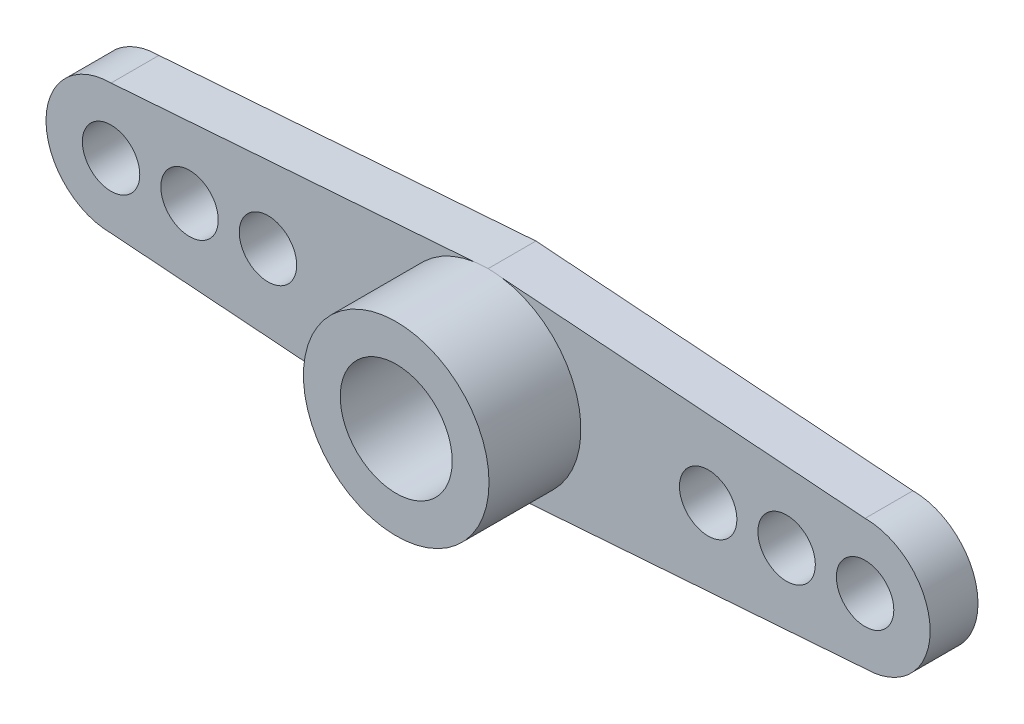
ISO-10303-21;
HEADER;
FILE_DESCRIPTION(('STEP AP214'),'2;1');
FILE_NAME('part.step','',(''),(''),'','','');
FILE_SCHEMA(('AUTOMOTIVE_DESIGN { 1 0 10303 214 1 1 1 1 }'));
ENDSEC;
DATA;
#1=APPLICATION_CONTEXT('core data for automotive mechanical design processes');
#2=APPLICATION_PROTOCOL_DEFINITION('international standard','automotive_design',2000,#1);
#3=PRODUCT_CONTEXT('',#1,'mechanical');
#4=PRODUCT('Part','Part','',(#3));
#5=PRODUCT_RELATED_PRODUCT_CATEGORY('part','',(#4));
#6=PRODUCT_DEFINITION_FORMATION('','',#4);
#7=PRODUCT_DEFINITION_CONTEXT('part definition',#1,'design');
#8=PRODUCT_DEFINITION('design','',#6,#7);
#9=PRODUCT_DEFINITION_SHAPE('','',#8);
#10=(LENGTH_UNIT() NAMED_UNIT(*) SI_UNIT(.MILLI.,.METRE.));
#11=(NAMED_UNIT(*) PLANE_ANGLE_UNIT() SI_UNIT($,.RADIAN.));
#12=(NAMED_UNIT(*) SI_UNIT($,.STERADIAN.) SOLID_ANGLE_UNIT());
#13=UNCERTAINTY_MEASURE_WITH_UNIT(LENGTH_MEASURE(1.E-05),#10,'distance_accuracy_value','');
#14=(GEOMETRIC_REPRESENTATION_CONTEXT(3) GLOBAL_UNCERTAINTY_ASSIGNED_CONTEXT((#13)) GLOBAL_UNIT_ASSIGNED_CONTEXT((#10,
#11,#12)) REPRESENTATION_CONTEXT('',''));
#15=CARTESIAN_POINT('',(0.,0.,0.));
#16=DIRECTION('',(0.,0.,1.));
#17=DIRECTION('',(1.,0.,0.));
#18=AXIS2_PLACEMENT_3D('',#15,#16,#17);
#19=CARTESIAN_POINT('',(0.,0.,2.5));
#20=DIRECTION('',(0.,0.,1.));
#21=DIRECTION('',(1.,0.,0.));
#22=AXIS2_PLACEMENT_3D('',#19,#20,#21);
#23=PLANE('',#22);
#24=CARTESIAN_POINT('',(0.,0.,2.5));
#25=DIRECTION('',(0.,0.,1.));
#26=DIRECTION('',(1.,0.,0.));
#27=AXIS2_PLACEMENT_3D('',#24,#25,#26);
#28=CIRCLE('',#27,4.85);
#29=CARTESIAN_POINT('',(-0.710112316356675,4.79773284981131,2.5));
#30=VERTEX_POINT('',#29);
#31=CARTESIAN_POINT('',(-0.710112316356675,-4.79773284981131,2.5));
#32=VERTEX_POINT('',#31);
#33=EDGE_CURVE('E11',#30,#32,#28,.T.);
#34=ORIENTED_EDGE('',*,*,#33,.F.);
#35=DIRECTION('',(0.997302177878483,0.0734054902499391,0.));
#36=VECTOR('',#35,1.);
#37=CARTESIAN_POINT('',(-0.355056158178335,4.82386642490565,2.5));
#38=LINE('',#37,#36);
#39=CARTESIAN_POINT('',(-19.7,3.4,2.5));
#40=VERTEX_POINT('',#39);
#41=EDGE_CURVE('E310',#40,#30,#38,.T.);
#42=ORIENTED_EDGE('',*,*,#41,.F.);
#43=CARTESIAN_POINT('',(-19.7,0.,2.5));
#44=DIRECTION('',(0.,0.,1.));
#45=DIRECTION('',(1.,0.,0.));
#46=AXIS2_PLACEMENT_3D('',#43,#44,#45);
#47=CIRCLE('',#46,3.4);
#48=CARTESIAN_POINT('',(-19.7,-3.4,2.5));
#49=VERTEX_POINT('',#48);
#50=EDGE_CURVE('E302',#40,#49,#47,.T.);
#51=ORIENTED_EDGE('',*,*,#50,.T.);
#52=DIRECTION('',(0.997302177878483,-0.0734054902499391,0.));
#53=VECTOR('',#52,1.);
#54=CARTESIAN_POINT('',(-0.355056158178335,-4.82386642490565,2.5));
#55=LINE('',#54,#53);
#56=EDGE_CURVE('E319',#49,#32,#55,.T.);
#57=ORIENTED_EDGE('',*,*,#56,.T.);
#58=EDGE_LOOP('',(#34,#42,#51,#57));
#59=FACE_BOUND('',#58,.T.);
#60=CARTESIAN_POINT('',(-11.5,0.,2.5));
#61=DIRECTION('',(0.,0.,1.));
#62=DIRECTION('',(1.,0.,0.));
#63=AXIS2_PLACEMENT_3D('',#60,#61,#62);
#64=CIRCLE('',#63,1.5);
#65=CARTESIAN_POINT('',(-10.,0.,2.5));
#66=VERTEX_POINT('',#65);
#67=EDGE_CURVE('E312',#66,#66,#64,.T.);
#68=ORIENTED_EDGE('',*,*,#67,.F.);
#69=EDGE_LOOP('',(#68));
#70=FACE_BOUND('',#69,.T.);
#71=CARTESIAN_POINT('',(-15.6,0.,2.5));
#72=DIRECTION('',(0.,0.,1.));
#73=DIRECTION('',(1.,0.,0.));
#74=AXIS2_PLACEMENT_3D('',#71,#72,#73);
#75=CIRCLE('',#74,1.5);
#76=CARTESIAN_POINT('',(-14.1,0.,2.5));
#77=VERTEX_POINT('',#76);
#78=EDGE_CURVE('E241',#77,#77,#75,.T.);
#79=ORIENTED_EDGE('',*,*,#78,.F.);
#80=EDGE_LOOP('',(#79));
#81=FACE_BOUND('',#80,.T.);
#82=CARTESIAN_POINT('',(-19.7,0.,2.5));
#83=DIRECTION('',(0.,0.,1.));
#84=DIRECTION('',(1.,0.,0.));
#85=AXIS2_PLACEMENT_3D('',#82,#83,#84);
#86=CIRCLE('',#85,1.5);
#87=CARTESIAN_POINT('',(-18.2,0.,2.5));
#88=VERTEX_POINT('',#87);
#89=EDGE_CURVE('E285',#88,#88,#86,.T.);
#90=ORIENTED_EDGE('',*,*,#89,.F.);
#91=EDGE_LOOP('',(#90));
#92=FACE_BOUND('',#91,.T.);
#93=ADVANCED_FACE('F39',(#59,#70,#81,#92),#23,.T.);
#94=CARTESIAN_POINT('',(-0.355056158178335,4.82386642490565,2.5));
#95=DIRECTION('',(-0.0734054902499391,0.997302177878483,0.));
#96=DIRECTION('',(-0.997302177878483,-0.0734054902499391,0.));
#97=AXIS2_PLACEMENT_3D('',#94,#95,#96);
#98=PLANE('',#97);
#99=DIRECTION('',(0.997302177878483,0.0734054902499391,0.));
#100=VECTOR('',#99,1.);
#101=CARTESIAN_POINT('',(-0.355056158178335,4.82386642490565,0.));
#102=LINE('',#101,#100);
#103=CARTESIAN_POINT('',(-19.7,3.4,0.));
#104=VERTEX_POINT('',#103);
#105=CARTESIAN_POINT('',(0.,4.85,0.));
#106=VERTEX_POINT('',#105);
#107=EDGE_CURVE('E250',#104,#106,#102,.T.);
#108=ORIENTED_EDGE('',*,*,#107,.F.);
#109=DIRECTION('',(0.,0.,-1.));
#110=VECTOR('',#109,1.);
#111=CARTESIAN_POINT('',(-19.7,3.4,2.5));
#112=LINE('',#111,#110);
#113=EDGE_CURVE('E133',#40,#104,#112,.T.);
#114=ORIENTED_EDGE('',*,*,#113,.F.);
#115=ORIENTED_EDGE('',*,*,#41,.T.);
#116=CARTESIAN_POINT('',(0.,4.85,2.5));
#117=VERTEX_POINT('',#116);
#118=EDGE_CURVE('E309',#30,#117,#38,.T.);
#119=ORIENTED_EDGE('',*,*,#118,.T.);
#120=DIRECTION('',(0.,0.,-1.));
#121=VECTOR('',#120,1.);
#122=CARTESIAN_POINT('',(0.,4.85,2.5));
#123=LINE('',#122,#121);
#124=EDGE_CURVE('E113',#117,#106,#123,.T.);
#125=ORIENTED_EDGE('',*,*,#124,.T.);
#126=EDGE_LOOP('',(#108,#114,#115,#119,#125));
#127=FACE_BOUND('',#126,.T.);
#128=ADVANCED_FACE('F172',(#127),#98,.T.);
#129=CARTESIAN_POINT('',(-19.7,0.,2.5));
#130=DIRECTION('',(0.,0.,-1.));
#131=DIRECTION('',(-1.,0.,0.));
#132=AXIS2_PLACEMENT_3D('',#129,#130,#131);
#133=CYLINDRICAL_SURFACE('',#132,3.4);
#134=CARTESIAN_POINT('',(-19.7,0.,0.));
#135=DIRECTION('',(0.,0.,1.));
#136=DIRECTION('',(1.,0.,0.));
#137=AXIS2_PLACEMENT_3D('',#134,#135,#136);
#138=CIRCLE('',#137,3.4);
#139=CARTESIAN_POINT('',(-19.7,-3.4,0.));
#140=VERTEX_POINT('',#139);
#141=EDGE_CURVE('E258',#104,#140,#138,.T.);
#142=ORIENTED_EDGE('',*,*,#141,.T.);
#143=DIRECTION('',(0.,0.,-1.));
#144=VECTOR('',#143,1.);
#145=CARTESIAN_POINT('',(-19.7,-3.4,2.5));
#146=LINE('',#145,#144);
#147=EDGE_CURVE('E296',#49,#140,#146,.T.);
#148=ORIENTED_EDGE('',*,*,#147,.F.);
#149=ORIENTED_EDGE('',*,*,#50,.F.);
#150=ORIENTED_EDGE('',*,*,#113,.T.);
#151=EDGE_LOOP('',(#142,#148,#149,#150));
#152=FACE_BOUND('',#151,.T.);
#153=ADVANCED_FACE('F178',(#152),#133,.T.);
#154=CARTESIAN_POINT('',(-0.355056158178335,-4.82386642490565,2.5));
#155=DIRECTION('',(0.0734054902499391,0.997302177878483,0.));
#156=DIRECTION('',(-0.997302177878483,0.0734054902499391,0.));
#157=AXIS2_PLACEMENT_3D('',#154,#155,#156);
#158=PLANE('',#157);
#159=DIRECTION('',(0.997302177878483,-0.0734054902499391,0.));
#160=VECTOR('',#159,1.);
#161=CARTESIAN_POINT('',(-0.355056158178335,-4.82386642490565,0.));
#162=LINE('',#161,#160);
#163=CARTESIAN_POINT('',(0.,-4.85,0.));
#164=VERTEX_POINT('',#163);
#165=EDGE_CURVE('E261',#140,#164,#162,.T.);
#166=ORIENTED_EDGE('',*,*,#165,.T.);
#167=DIRECTION('',(0.,0.,-1.));
#168=VECTOR('',#167,1.);
#169=CARTESIAN_POINT('',(0.,-4.85,2.5));
#170=LINE('',#169,#168);
#171=CARTESIAN_POINT('',(0.,-4.85,2.5));
#172=VERTEX_POINT('',#171);
#173=EDGE_CURVE('E293',#172,#164,#170,.T.);
#174=ORIENTED_EDGE('',*,*,#173,.F.);
#175=EDGE_CURVE('E64',#32,#172,#55,.T.);
#176=ORIENTED_EDGE('',*,*,#175,.F.);
#177=ORIENTED_EDGE('',*,*,#56,.F.);
#178=ORIENTED_EDGE('',*,*,#147,.T.);
#179=EDGE_LOOP('',(#166,#174,#176,#177,#178));
#180=FACE_BOUND('',#179,.T.);
#181=ADVANCED_FACE('F225',(#180),#158,.F.);
#182=CARTESIAN_POINT('',(0.355056158178335,-4.82386642490565,2.5));
#183=DIRECTION('',(-0.0734054902499391,0.997302177878483,0.));
#184=DIRECTION('',(-0.997302177878483,-0.0734054902499391,0.));
#185=AXIS2_PLACEMENT_3D('',#182,#183,#184);
#186=PLANE('',#185);
#187=DIRECTION('',(0.997302177878483,0.0734054902499391,0.));
#188=VECTOR('',#187,1.);
#189=CARTESIAN_POINT('',(0.355056158178335,-4.82386642490565,0.));
#190=LINE('',#189,#188);
#191=CARTESIAN_POINT('',(19.7,-3.4,0.));
#192=VERTEX_POINT('',#191);
#193=EDGE_CURVE('E264',#164,#192,#190,.T.);
#194=ORIENTED_EDGE('',*,*,#193,.T.);
#195=DIRECTION('',(0.,0.,-1.));
#196=VECTOR('',#195,1.);
#197=CARTESIAN_POINT('',(19.7,-3.4,2.5));
#198=LINE('',#197,#196);
#199=CARTESIAN_POINT('',(19.7,-3.4,2.5));
#200=VERTEX_POINT('',#199);
#201=EDGE_CURVE('E290',#200,#192,#198,.T.);
#202=ORIENTED_EDGE('',*,*,#201,.F.);
#203=DIRECTION('',(0.997302177878483,0.0734054902499391,0.));
#204=VECTOR('',#203,1.);
#205=CARTESIAN_POINT('',(0.355056158178335,-4.82386642490565,2.5));
#206=LINE('',#205,#204);
#207=CARTESIAN_POINT('',(0.710112316356675,-4.79773284981131,2.5));
#208=VERTEX_POINT('',#207);
#209=EDGE_CURVE('E321',#208,#200,#206,.T.);
#210=ORIENTED_EDGE('',*,*,#209,.F.);
#211=EDGE_CURVE('E322',#172,#208,#206,.T.);
#212=ORIENTED_EDGE('',*,*,#211,.F.);
#213=ORIENTED_EDGE('',*,*,#173,.T.);
#214=EDGE_LOOP('',(#194,#202,#210,#212,#213));
#215=FACE_BOUND('',#214,.T.);
#216=ADVANCED_FACE('F221',(#215),#186,.F.);
#217=CARTESIAN_POINT('',(19.7,0.,2.5));
#218=DIRECTION('',(0.,0.,-1.));
#219=DIRECTION('',(-1.,0.,0.));
#220=AXIS2_PLACEMENT_3D('',#217,#218,#219);
#221=CYLINDRICAL_SURFACE('',#220,3.4);
#222=CARTESIAN_POINT('',(19.7,0.,0.));
#223=DIRECTION('',(0.,0.,1.));
#224=DIRECTION('',(1.,0.,0.));
#225=AXIS2_PLACEMENT_3D('',#222,#223,#224);
#226=CIRCLE('',#225,3.4);
#227=CARTESIAN_POINT('',(19.7,3.4,0.));
#228=VERTEX_POINT('',#227);
#229=EDGE_CURVE('E267',#192,#228,#226,.T.);
#230=ORIENTED_EDGE('',*,*,#229,.T.);
#231=DIRECTION('',(0.,0.,-1.));
#232=VECTOR('',#231,1.);
#233=CARTESIAN_POINT('',(19.7,3.4,2.5));
#234=LINE('',#233,#232);
#235=CARTESIAN_POINT('',(19.7,3.4,2.5));
#236=VERTEX_POINT('',#235);
#237=EDGE_CURVE('E287',#236,#228,#234,.T.);
#238=ORIENTED_EDGE('',*,*,#237,.F.);
#239=CARTESIAN_POINT('',(19.7,0.,2.5));
#240=DIRECTION('',(0.,0.,1.));
#241=DIRECTION('',(1.,0.,0.));
#242=AXIS2_PLACEMENT_3D('',#239,#240,#241);
#243=CIRCLE('',#242,3.4);
#244=EDGE_CURVE('E122',#200,#236,#243,.T.);
#245=ORIENTED_EDGE('',*,*,#244,.F.);
#246=ORIENTED_EDGE('',*,*,#201,.T.);
#247=EDGE_LOOP('',(#230,#238,#245,#246));
#248=FACE_BOUND('',#247,.T.);
#249=ADVANCED_FACE('F207',(#248),#221,.T.);
#250=CARTESIAN_POINT('',(15.6,0.,2.5));
#251=DIRECTION('',(0.,0.,-1.));
#252=DIRECTION('',(-1.,0.,0.));
#253=AXIS2_PLACEMENT_3D('',#250,#251,#252);
#254=CYLINDRICAL_SURFACE('',#253,1.5);
#255=CARTESIAN_POINT('',(15.6,0.,2.5));
#256=DIRECTION('',(0.,0.,1.));
#257=DIRECTION('',(1.,0.,0.));
#258=AXIS2_PLACEMENT_3D('',#255,#256,#257);
#259=CIRCLE('',#258,1.5);
#260=CARTESIAN_POINT('',(17.1,0.,2.5));
#261=VERTEX_POINT('',#260);
#262=EDGE_CURVE('E330',#261,#261,#259,.T.);
#263=ORIENTED_EDGE('',*,*,#262,.T.);
#264=EDGE_LOOP('',(#263));
#265=FACE_BOUND('',#264,.T.);
#266=CARTESIAN_POINT('',(15.6,0.,0.));
#267=DIRECTION('',(0.,0.,1.));
#268=DIRECTION('',(1.,0.,0.));
#269=AXIS2_PLACEMENT_3D('',#266,#267,#268);
#270=CIRCLE('',#269,1.5);
#271=CARTESIAN_POINT('',(17.1,0.,0.));
#272=VERTEX_POINT('',#271);
#273=EDGE_CURVE('E279',#272,#272,#270,.T.);
#274=ORIENTED_EDGE('',*,*,#273,.F.);
#275=EDGE_LOOP('',(#274));
#276=FACE_BOUND('',#275,.T.);
#277=ADVANCED_FACE('F203',(#265,#276),#254,.F.);
#278=CARTESIAN_POINT('',(19.7,0.,2.5));
#279=DIRECTION('',(0.,0.,-1.));
#280=DIRECTION('',(-1.,0.,0.));
#281=AXIS2_PLACEMENT_3D('',#278,#279,#280);
#282=CYLINDRICAL_SURFACE('',#281,1.5);
#283=CARTESIAN_POINT('',(19.7,0.,2.5));
#284=DIRECTION('',(0.,0.,1.));
#285=DIRECTION('',(1.,0.,0.));
#286=AXIS2_PLACEMENT_3D('',#283,#284,#285);
#287=CIRCLE('',#286,1.5);
#288=CARTESIAN_POINT('',(21.2,0.,2.5));
#289=VERTEX_POINT('',#288);
#290=EDGE_CURVE('E117',#289,#289,#287,.T.);
#291=ORIENTED_EDGE('',*,*,#290,.T.);
#292=EDGE_LOOP('',(#291));
#293=FACE_BOUND('',#292,.T.);
#294=CARTESIAN_POINT('',(19.7,0.,0.));
#295=DIRECTION('',(0.,0.,1.));
#296=DIRECTION('',(1.,0.,0.));
#297=AXIS2_PLACEMENT_3D('',#294,#295,#296);
#298=CIRCLE('',#297,1.5);
#299=CARTESIAN_POINT('',(21.2,0.,0.));
#300=VERTEX_POINT('',#299);
#301=EDGE_CURVE('E276',#300,#300,#298,.T.);
#302=ORIENTED_EDGE('',*,*,#301,.F.);
#303=EDGE_LOOP('',(#302));
#304=FACE_BOUND('',#303,.T.);
#305=ADVANCED_FACE('F206',(#293,#304),#282,.F.);
#306=CARTESIAN_POINT('',(0.,0.,2.5));
#307=DIRECTION('',(0.,0.,-1.));
#308=DIRECTION('',(-1.,0.,0.));
#309=AXIS2_PLACEMENT_3D('',#306,#307,#308);
#310=CYLINDRICAL_SURFACE('',#309,3.);
#311=CARTESIAN_POINT('',(0.,0.,2.5));
#312=DIRECTION('',(0.,0.,1.));
#313=DIRECTION('',(1.,0.,0.));
#314=AXIS2_PLACEMENT_3D('',#311,#312,#313);
#315=CIRCLE('',#314,3.);
#316=CARTESIAN_POINT('',(3.,0.,2.5));
#317=VERTEX_POINT('',#316);
#318=EDGE_CURVE('E137',#317,#317,#315,.T.);
#319=ORIENTED_EDGE('',*,*,#318,.T.);
#320=EDGE_LOOP('',(#319));
#321=FACE_BOUND('',#320,.T.);
#322=CARTESIAN_POINT('',(0.,0.,0.));
#323=DIRECTION('',(0.,0.,1.));
#324=DIRECTION('',(1.,0.,0.));
#325=AXIS2_PLACEMENT_3D('',#322,#323,#324);
#326=CIRCLE('',#325,3.);
#327=CARTESIAN_POINT('',(3.,0.,0.));
#328=VERTEX_POINT('',#327);
#329=EDGE_CURVE('E273',#328,#328,#326,.T.);
#330=ORIENTED_EDGE('',*,*,#329,.F.);
#331=EDGE_LOOP('',(#330));
#332=FACE_BOUND('',#331,.T.);
#333=ADVANCED_FACE('F211',(#321,#332),#310,.F.);
#334=CARTESIAN_POINT('',(0.355056158178335,4.82386642490565,2.5));
#335=DIRECTION('',(0.0734054902499391,0.997302177878483,0.));
#336=DIRECTION('',(-0.997302177878483,0.0734054902499391,0.));
#337=AXIS2_PLACEMENT_3D('',#334,#335,#336);
#338=PLANE('',#337);
#339=DIRECTION('',(0.997302177878483,-0.0734054902499391,0.));
#340=VECTOR('',#339,1.);
#341=CARTESIAN_POINT('',(0.355056158178335,4.82386642490565,0.));
#342=LINE('',#341,#340);
#343=EDGE_CURVE('E270',#106,#228,#342,.T.);
#344=ORIENTED_EDGE('',*,*,#343,.F.);
#345=ORIENTED_EDGE('',*,*,#124,.F.);
#346=DIRECTION('',(0.997302177878483,-0.0734054902499391,0.));
#347=VECTOR('',#346,1.);
#348=CARTESIAN_POINT('',(0.355056158178335,4.82386642490565,2.5));
#349=LINE('',#348,#347);
#350=CARTESIAN_POINT('',(0.710112316356675,4.79773284981131,2.5));
#351=VERTEX_POINT('',#350);
#352=EDGE_CURVE('E108',#117,#351,#349,.T.);
#353=ORIENTED_EDGE('',*,*,#352,.T.);
#354=EDGE_CURVE('E111',#351,#236,#349,.T.);
#355=ORIENTED_EDGE('',*,*,#354,.T.);
#356=ORIENTED_EDGE('',*,*,#237,.T.);
#357=EDGE_LOOP('',(#344,#345,#353,#355,#356));
#358=FACE_BOUND('',#357,.T.);
#359=ADVANCED_FACE('F110',(#358),#338,.T.);
#360=CARTESIAN_POINT('',(-11.5,0.,2.5));
#361=DIRECTION('',(0.,0.,-1.));
#362=DIRECTION('',(-1.,0.,0.));
#363=AXIS2_PLACEMENT_3D('',#360,#361,#362);
#364=CYLINDRICAL_SURFACE('',#363,1.5);
#365=ORIENTED_EDGE('',*,*,#67,.T.);
#366=EDGE_LOOP('',(#365));
#367=FACE_BOUND('',#366,.T.);
#368=CARTESIAN_POINT('',(-11.5,0.,0.));
#369=DIRECTION('',(0.,0.,1.));
#370=DIRECTION('',(1.,0.,0.));
#371=AXIS2_PLACEMENT_3D('',#368,#369,#370);
#372=CIRCLE('',#371,1.5);
#373=CARTESIAN_POINT('',(-10.,0.,0.));
#374=VERTEX_POINT('',#373);
#375=EDGE_CURVE('E246',#374,#374,#372,.T.);
#376=ORIENTED_EDGE('',*,*,#375,.F.);
#377=EDGE_LOOP('',(#376));
#378=FACE_BOUND('',#377,.T.);
#379=ADVANCED_FACE('F218',(#367,#378),#364,.F.);
#380=CARTESIAN_POINT('',(-15.6,0.,2.5));
#381=DIRECTION('',(0.,0.,-1.));
#382=DIRECTION('',(-1.,0.,0.));
#383=AXIS2_PLACEMENT_3D('',#380,#381,#382);
#384=CYLINDRICAL_SURFACE('',#383,1.5);
#385=ORIENTED_EDGE('',*,*,#78,.T.);
#386=EDGE_LOOP('',(#385));
#387=FACE_BOUND('',#386,.T.);
#388=CARTESIAN_POINT('',(-15.6,0.,0.));
#389=DIRECTION('',(0.,0.,1.));
#390=DIRECTION('',(1.,0.,0.));
#391=AXIS2_PLACEMENT_3D('',#388,#389,#390);
#392=CIRCLE('',#391,1.5);
#393=CARTESIAN_POINT('',(-14.1,0.,0.));
#394=VERTEX_POINT('',#393);
#395=EDGE_CURVE('E244',#394,#394,#392,.T.);
#396=ORIENTED_EDGE('',*,*,#395,.F.);
#397=EDGE_LOOP('',(#396));
#398=FACE_BOUND('',#397,.T.);
#399=ADVANCED_FACE('F198',(#387,#398),#384,.F.);
#400=CARTESIAN_POINT('',(-19.7,0.,2.5));
#401=DIRECTION('',(0.,0.,-1.));
#402=DIRECTION('',(-1.,0.,0.));
#403=AXIS2_PLACEMENT_3D('',#400,#401,#402);
#404=CYLINDRICAL_SURFACE('',#403,1.5);
#405=ORIENTED_EDGE('',*,*,#89,.T.);
#406=EDGE_LOOP('',(#405));
#407=FACE_BOUND('',#406,.T.);
#408=CARTESIAN_POINT('',(-19.7,0.,0.));
#409=DIRECTION('',(0.,0.,1.));
#410=DIRECTION('',(1.,0.,0.));
#411=AXIS2_PLACEMENT_3D('',#408,#409,#410);
#412=CIRCLE('',#411,1.5);
#413=CARTESIAN_POINT('',(-18.2,0.,0.));
#414=VERTEX_POINT('',#413);
#415=EDGE_CURVE('E247',#414,#414,#412,.T.);
#416=ORIENTED_EDGE('',*,*,#415,.F.);
#417=EDGE_LOOP('',(#416));
#418=FACE_BOUND('',#417,.T.);
#419=ADVANCED_FACE('F41',(#407,#418),#404,.F.);
#420=CARTESIAN_POINT('',(11.5,0.,2.5));
#421=DIRECTION('',(0.,0.,-1.));
#422=DIRECTION('',(-1.,0.,0.));
#423=AXIS2_PLACEMENT_3D('',#420,#421,#422);
#424=CYLINDRICAL_SURFACE('',#423,1.5);
#425=CARTESIAN_POINT('',(11.5,0.,2.5));
#426=DIRECTION('',(0.,0.,1.));
#427=DIRECTION('',(1.,0.,0.));
#428=AXIS2_PLACEMENT_3D('',#425,#426,#427);
#429=CIRCLE('',#428,1.5);
#430=CARTESIAN_POINT('',(13.,0.,2.5));
#431=VERTEX_POINT('',#430);
#432=EDGE_CURVE('E288',#431,#431,#429,.T.);
#433=ORIENTED_EDGE('',*,*,#432,.T.);
#434=EDGE_LOOP('',(#433));
#435=FACE_BOUND('',#434,.T.);
#436=CARTESIAN_POINT('',(11.5,0.,0.));
#437=DIRECTION('',(0.,0.,1.));
#438=DIRECTION('',(1.,0.,0.));
#439=AXIS2_PLACEMENT_3D('',#436,#437,#438);
#440=CIRCLE('',#439,1.5);
#441=CARTESIAN_POINT('',(13.,0.,0.));
#442=VERTEX_POINT('',#441);
#443=EDGE_CURVE('E282',#442,#442,#440,.T.);
#444=ORIENTED_EDGE('',*,*,#443,.F.);
#445=EDGE_LOOP('',(#444));
#446=FACE_BOUND('',#445,.T.);
#447=ADVANCED_FACE('F186',(#435,#446),#424,.F.);
#448=EDGE_CURVE('E48',#208,#351,#28,.T.);
#449=ORIENTED_EDGE('',*,*,#448,.F.);
#450=ORIENTED_EDGE('',*,*,#209,.T.);
#451=ORIENTED_EDGE('',*,*,#244,.T.);
#452=ORIENTED_EDGE('',*,*,#354,.F.);
#453=EDGE_LOOP('',(#449,#450,#451,#452));
#454=FACE_BOUND('',#453,.T.);
#455=ORIENTED_EDGE('',*,*,#290,.F.);
#456=EDGE_LOOP('',(#455));
#457=FACE_BOUND('',#456,.T.);
#458=ORIENTED_EDGE('',*,*,#262,.F.);
#459=EDGE_LOOP('',(#458));
#460=FACE_BOUND('',#459,.T.);
#461=ORIENTED_EDGE('',*,*,#432,.F.);
#462=EDGE_LOOP('',(#461));
#463=FACE_BOUND('',#462,.T.);
#464=ADVANCED_FACE('F119',(#454,#457,#460,#463),#23,.T.);
#465=CARTESIAN_POINT('',(0.,0.,0.));
#466=DIRECTION('',(0.,0.,1.));
#467=DIRECTION('',(1.,0.,0.));
#468=AXIS2_PLACEMENT_3D('',#465,#466,#467);
#469=PLANE('',#468);
#470=ORIENTED_EDGE('',*,*,#415,.T.);
#471=EDGE_LOOP('',(#470));
#472=FACE_BOUND('',#471,.T.);
#473=ORIENTED_EDGE('',*,*,#395,.T.);
#474=EDGE_LOOP('',(#473));
#475=FACE_BOUND('',#474,.T.);
#476=ORIENTED_EDGE('',*,*,#375,.T.);
#477=EDGE_LOOP('',(#476));
#478=FACE_BOUND('',#477,.T.);
#479=ORIENTED_EDGE('',*,*,#107,.T.);
#480=ORIENTED_EDGE('',*,*,#343,.T.);
#481=ORIENTED_EDGE('',*,*,#229,.F.);
#482=ORIENTED_EDGE('',*,*,#193,.F.);
#483=ORIENTED_EDGE('',*,*,#165,.F.);
#484=ORIENTED_EDGE('',*,*,#141,.F.);
#485=EDGE_LOOP('',(#479,#480,#481,#482,#483,#484));
#486=FACE_BOUND('',#485,.T.);
#487=ORIENTED_EDGE('',*,*,#329,.T.);
#488=EDGE_LOOP('',(#487));
#489=FACE_BOUND('',#488,.T.);
#490=ORIENTED_EDGE('',*,*,#301,.T.);
#491=EDGE_LOOP('',(#490));
#492=FACE_BOUND('',#491,.T.);
#493=ORIENTED_EDGE('',*,*,#273,.T.);
#494=EDGE_LOOP('',(#493));
#495=FACE_BOUND('',#494,.T.);
#496=ORIENTED_EDGE('',*,*,#443,.T.);
#497=EDGE_LOOP('',(#496));
#498=FACE_BOUND('',#497,.T.);
#499=ADVANCED_FACE('F185',(#472,#475,#478,#486,#489,#492,#495,#498),#469,.F.);
#500=CARTESIAN_POINT('',(0.,0.,7.3));
#501=DIRECTION('',(0.,0.,1.));
#502=DIRECTION('',(1.,0.,0.));
#503=AXIS2_PLACEMENT_3D('',#500,#501,#502);
#504=PLANE('',#503);
#505=CARTESIAN_POINT('',(0.,0.,7.3));
#506=DIRECTION('',(0.,0.,1.));
#507=DIRECTION('',(1.,0.,0.));
#508=AXIS2_PLACEMENT_3D('',#505,#506,#507);
#509=CIRCLE('',#508,2.925);
#510=CARTESIAN_POINT('',(2.925,0.,7.3));
#511=VERTEX_POINT('',#510);
#512=EDGE_CURVE('E143',#511,#511,#509,.T.);
#513=ORIENTED_EDGE('',*,*,#512,.F.);
#514=EDGE_LOOP('',(#513));
#515=FACE_BOUND('',#514,.T.);
#516=CARTESIAN_POINT('',(0.,0.,7.3));
#517=DIRECTION('',(0.,0.,1.));
#518=DIRECTION('',(1.,0.,0.));
#519=AXIS2_PLACEMENT_3D('',#516,#517,#518);
#520=CIRCLE('',#519,4.85);
#521=CARTESIAN_POINT('',(4.85,0.,7.3));
#522=VERTEX_POINT('',#521);
#523=EDGE_CURVE('E135',#522,#522,#520,.T.);
#524=ORIENTED_EDGE('',*,*,#523,.T.);
#525=EDGE_LOOP('',(#524));
#526=FACE_BOUND('',#525,.T.);
#527=ADVANCED_FACE('F191',(#515,#526),#504,.T.);
#528=CARTESIAN_POINT('',(0.,0.,7.3));
#529=DIRECTION('',(0.,0.,-1.));
#530=DIRECTION('',(-1.,0.,0.));
#531=AXIS2_PLACEMENT_3D('',#528,#529,#530);
#532=CYLINDRICAL_SURFACE('',#531,4.85);
#533=ORIENTED_EDGE('',*,*,#523,.F.);
#534=EDGE_LOOP('',(#533));
#535=FACE_BOUND('',#534,.T.);
#536=EDGE_CURVE('E129',#351,#117,#28,.T.);
#537=ORIENTED_EDGE('',*,*,#536,.T.);
#538=EDGE_CURVE('E50',#117,#30,#28,.T.);
#539=ORIENTED_EDGE('',*,*,#538,.T.);
#540=ORIENTED_EDGE('',*,*,#33,.T.);
#541=EDGE_CURVE('E139',#32,#172,#28,.T.);
#542=ORIENTED_EDGE('',*,*,#541,.T.);
#543=EDGE_CURVE('E132',#172,#208,#28,.T.);
#544=ORIENTED_EDGE('',*,*,#543,.T.);
#545=ORIENTED_EDGE('',*,*,#448,.T.);
#546=EDGE_LOOP('',(#537,#539,#540,#542,#544,#545));
#547=FACE_BOUND('',#546,.T.);
#548=ADVANCED_FACE('F127',(#535,#547),#532,.T.);
#549=CARTESIAN_POINT('',(0.,0.,2.5));
#550=DIRECTION('',(0.,0.,1.));
#551=DIRECTION('',(1.,0.,0.));
#552=AXIS2_PLACEMENT_3D('',#549,#550,#551);
#553=PLANE('',#552);
#554=ORIENTED_EDGE('',*,*,#352,.F.);
#555=ORIENTED_EDGE('',*,*,#536,.F.);
#556=EDGE_LOOP('',(#554,#555));
#557=FACE_BOUND('',#556,.T.);
#558=ADVANCED_FACE('F134',(#557),#553,.F.);
#559=ORIENTED_EDGE('',*,*,#118,.F.);
#560=ORIENTED_EDGE('',*,*,#538,.F.);
#561=EDGE_LOOP('',(#559,#560));
#562=FACE_BOUND('',#561,.T.);
#563=ADVANCED_FACE('F359',(#562),#553,.F.);
#564=ORIENTED_EDGE('',*,*,#543,.F.);
#565=ORIENTED_EDGE('',*,*,#211,.T.);
#566=EDGE_LOOP('',(#564,#565));
#567=FACE_BOUND('',#566,.T.);
#568=ADVANCED_FACE('F355',(#567),#553,.F.);
#569=ORIENTED_EDGE('',*,*,#541,.F.);
#570=ORIENTED_EDGE('',*,*,#175,.T.);
#571=EDGE_LOOP('',(#569,#570));
#572=FACE_BOUND('',#571,.T.);
#573=ADVANCED_FACE('F349',(#572),#553,.F.);
#574=CARTESIAN_POINT('',(0.,0.,2.5));
#575=DIRECTION('',(0.,0.,-1.));
#576=DIRECTION('',(-1.,0.,0.));
#577=AXIS2_PLACEMENT_3D('',#574,#575,#576);
#578=CIRCLE('',#577,1.5);
#579=CARTESIAN_POINT('',(-1.5,0.,2.5));
#580=VERTEX_POINT('',#579);
#581=EDGE_CURVE('E150',#580,#580,#578,.T.);
#582=ORIENTED_EDGE('',*,*,#581,.F.);
#583=EDGE_LOOP('',(#582));
#584=FACE_BOUND('',#583,.T.);
#585=ORIENTED_EDGE('',*,*,#318,.F.);
#586=EDGE_LOOP('',(#585));
#587=FACE_BOUND('',#586,.T.);
#588=ADVANCED_FACE('F168',(#584,#587),#553,.F.);
#589=CARTESIAN_POINT('',(0.,0.,2.8));
#590=DIRECTION('',(0.,0.,1.));
#591=DIRECTION('',(1.,0.,0.));
#592=AXIS2_PLACEMENT_3D('',#589,#590,#591);
#593=CYLINDRICAL_SURFACE('',#592,2.925);
#594=CARTESIAN_POINT('',(0.,0.,2.8));
#595=DIRECTION('',(0.,0.,1.));
#596=DIRECTION('',(1.,0.,0.));
#597=AXIS2_PLACEMENT_3D('',#594,#595,#596);
#598=CIRCLE('',#597,2.925);
#599=CARTESIAN_POINT('',(2.925,0.,2.8));
#600=VERTEX_POINT('',#599);
#601=EDGE_CURVE('E141',#600,#600,#598,.T.);
#602=ORIENTED_EDGE('',*,*,#601,.F.);
#603=EDGE_LOOP('',(#602));
#604=FACE_BOUND('',#603,.T.);
#605=ORIENTED_EDGE('',*,*,#512,.T.);
#606=EDGE_LOOP('',(#605));
#607=FACE_BOUND('',#606,.T.);
#608=ADVANCED_FACE('F161',(#604,#607),#593,.F.);
#609=CARTESIAN_POINT('',(0.,0.,2.8));
#610=DIRECTION('',(0.,0.,1.));
#611=DIRECTION('',(1.,0.,0.));
#612=AXIS2_PLACEMENT_3D('',#609,#610,#611);
#613=PLANE('',#612);
#614=CARTESIAN_POINT('',(0.,0.,2.8));
#615=DIRECTION('',(0.,0.,1.));
#616=DIRECTION('',(1.,0.,0.));
#617=AXIS2_PLACEMENT_3D('',#614,#615,#616);
#618=CIRCLE('',#617,1.5);
#619=CARTESIAN_POINT('',(1.5,0.,2.8));
#620=VERTEX_POINT('',#619);
#621=EDGE_CURVE('E43',#620,#620,#618,.T.);
#622=ORIENTED_EDGE('',*,*,#621,.F.);
#623=EDGE_LOOP('',(#622));
#624=FACE_BOUND('',#623,.T.);
#625=ORIENTED_EDGE('',*,*,#601,.T.);
#626=EDGE_LOOP('',(#625));
#627=FACE_BOUND('',#626,.T.);
#628=ADVANCED_FACE('F159',(#624,#627),#613,.T.);
#629=CARTESIAN_POINT('',(0.,0.,7.));
#630=DIRECTION('',(0.,0.,-1.));
#631=DIRECTION('',(-1.,0.,0.));
#632=AXIS2_PLACEMENT_3D('',#629,#630,#631);
#633=CYLINDRICAL_SURFACE('',#632,1.5);
#634=ORIENTED_EDGE('',*,*,#621,.T.);
#635=EDGE_LOOP('',(#634));
#636=FACE_BOUND('',#635,.T.);
#637=ORIENTED_EDGE('',*,*,#581,.T.);
#638=EDGE_LOOP('',(#637));
#639=FACE_BOUND('',#638,.T.);
#640=ADVANCED_FACE('F157',(#636,#639),#633,.F.);
#641=CLOSED_SHELL('',(#93,#128,#153,#181,#216,#249,#277,#305,#333,#359,#379,#399,#419,#447,#464,
#499,#527,#548,#558,#563,#568,#573,#588,#608,#628,#640));
#642=MANIFOLD_SOLID_BREP('B2',#641);
#643=ADVANCED_BREP_SHAPE_REPRESENTATION('',(#18,#642),#14);
#644=SHAPE_DEFINITION_REPRESENTATION(#9,#643);
ENDSEC;
END-ISO-10303-21;
